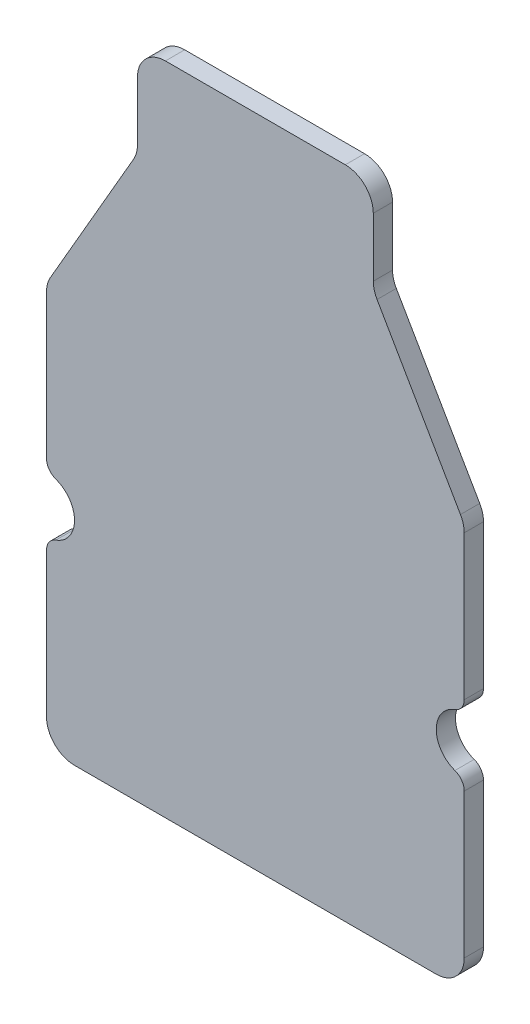
ISO-10303-21;
HEADER;
FILE_DESCRIPTION(('STEP AP214'),'2;1');
FILE_NAME('part.step','',(''),(''),'','','');
FILE_SCHEMA(('AUTOMOTIVE_DESIGN { 1 0 10303 214 1 1 1 1 }'));
ENDSEC;
DATA;
#1=APPLICATION_CONTEXT('core data for automotive mechanical design processes');
#2=APPLICATION_PROTOCOL_DEFINITION('international standard','automotive_design',2000,#1);
#3=PRODUCT_CONTEXT('',#1,'mechanical');
#4=PRODUCT('Part','Part','',(#3));
#5=PRODUCT_RELATED_PRODUCT_CATEGORY('part','',(#4));
#6=PRODUCT_DEFINITION_FORMATION('','',#4);
#7=PRODUCT_DEFINITION_CONTEXT('part definition',#1,'design');
#8=PRODUCT_DEFINITION('design','',#6,#7);
#9=PRODUCT_DEFINITION_SHAPE('','',#8);
#10=(LENGTH_UNIT() NAMED_UNIT(*) SI_UNIT(.MILLI.,.METRE.));
#11=(NAMED_UNIT(*) PLANE_ANGLE_UNIT() SI_UNIT($,.RADIAN.));
#12=(NAMED_UNIT(*) SI_UNIT($,.STERADIAN.) SOLID_ANGLE_UNIT());
#13=UNCERTAINTY_MEASURE_WITH_UNIT(LENGTH_MEASURE(1.E-05),#10,'distance_accuracy_value','');
#14=(GEOMETRIC_REPRESENTATION_CONTEXT(3) GLOBAL_UNCERTAINTY_ASSIGNED_CONTEXT((#13)) GLOBAL_UNIT_ASSIGNED_CONTEXT((#10,
#11,#12)) REPRESENTATION_CONTEXT('',''));
#15=CARTESIAN_POINT('',(0.,0.,0.));
#16=DIRECTION('',(0.,0.,1.));
#17=DIRECTION('',(1.,0.,0.));
#18=AXIS2_PLACEMENT_3D('',#15,#16,#17);
#19=CARTESIAN_POINT('',(74.65,-72.15,6.88));
#20=DIRECTION('',(-1.,0.,0.));
#21=DIRECTION('',(0.,0.,1.));
#22=AXIS2_PLACEMENT_3D('',#19,#20,#21);
#23=PLANE('',#22);
#24=DIRECTION('',(0.,1.,0.));
#25=VECTOR('',#24,1.);
#26=CARTESIAN_POINT('',(74.65,-72.15,0.));
#27=LINE('',#26,#25);
#28=CARTESIAN_POINT('',(74.65,-62.15,0.));
#29=VERTEX_POINT('',#28);
#30=CARTESIAN_POINT('',(74.65,-10.4818815858866,0.));
#31=VERTEX_POINT('',#30);
#32=EDGE_CURVE('E440',#29,#31,#27,.T.);
#33=ORIENTED_EDGE('',*,*,#32,.T.);
#34=DIRECTION('',(0.,0.,1.));
#35=VECTOR('',#34,1.);
#36=CARTESIAN_POINT('',(74.65,-10.4818815858866,6.88));
#37=LINE('',#36,#35);
#38=CARTESIAN_POINT('',(74.65,-10.4818815858866,6.88));
#39=VERTEX_POINT('',#38);
#40=EDGE_CURVE('E374',#31,#39,#37,.T.);
#41=ORIENTED_EDGE('',*,*,#40,.T.);
#42=DIRECTION('',(0.,1.,0.));
#43=VECTOR('',#42,1.);
#44=CARTESIAN_POINT('',(74.65,-72.15,6.88));
#45=LINE('',#44,#43);
#46=CARTESIAN_POINT('',(74.65,-62.15,6.88));
#47=VERTEX_POINT('',#46);
#48=EDGE_CURVE('E418',#47,#39,#45,.T.);
#49=ORIENTED_EDGE('',*,*,#48,.F.);
#50=DIRECTION('',(0.,0.,-1.));
#51=VECTOR('',#50,1.);
#52=CARTESIAN_POINT('',(74.65,-62.15,6.88));
#53=LINE('',#52,#51);
#54=EDGE_CURVE('E317',#47,#29,#53,.T.);
#55=ORIENTED_EDGE('',*,*,#54,.T.);
#56=EDGE_LOOP('',(#33,#41,#49,#55));
#57=FACE_BOUND('',#56,.T.);
#58=ADVANCED_FACE('F40',(#57),#23,.F.);
#59=CARTESIAN_POINT('',(-74.65,-72.15,6.88));
#60=DIRECTION('',(1.,0.,0.));
#61=DIRECTION('',(0.,0.,-1.));
#62=AXIS2_PLACEMENT_3D('',#59,#60,#61);
#63=PLANE('',#62);
#64=DIRECTION('',(0.,-1.,0.));
#65=VECTOR('',#64,1.);
#66=CARTESIAN_POINT('',(-74.65,-72.15,0.));
#67=LINE('',#66,#65);
#68=CARTESIAN_POINT('',(-74.65,69.4705080756887,0.));
#69=VERTEX_POINT('',#68);
#70=CARTESIAN_POINT('',(-74.65,17.8023896615754,0.));
#71=VERTEX_POINT('',#70);
#72=EDGE_CURVE('E402',#69,#71,#67,.T.);
#73=ORIENTED_EDGE('',*,*,#72,.T.);
#74=DIRECTION('',(0.,0.,1.));
#75=VECTOR('',#74,1.);
#76=CARTESIAN_POINT('',(-74.65,17.8023896615754,6.88));
#77=LINE('',#76,#75);
#78=CARTESIAN_POINT('',(-74.65,17.8023896615754,6.88));
#79=VERTEX_POINT('',#78);
#80=EDGE_CURVE('E377',#71,#79,#77,.T.);
#81=ORIENTED_EDGE('',*,*,#80,.T.);
#82=DIRECTION('',(0.,-1.,0.));
#83=VECTOR('',#82,1.);
#84=CARTESIAN_POINT('',(-74.65,-72.15,6.88));
#85=LINE('',#84,#83);
#86=CARTESIAN_POINT('',(-74.65,69.4705080756887,6.88));
#87=VERTEX_POINT('',#86);
#88=EDGE_CURVE('E400',#87,#79,#85,.T.);
#89=ORIENTED_EDGE('',*,*,#88,.F.);
#90=DIRECTION('',(0.,0.,-1.));
#91=VECTOR('',#90,1.);
#92=CARTESIAN_POINT('',(-74.65,69.4705080756887,6.88));
#93=LINE('',#92,#91);
#94=EDGE_CURVE('E326',#87,#69,#93,.T.);
#95=ORIENTED_EDGE('',*,*,#94,.T.);
#96=EDGE_LOOP('',(#73,#81,#89,#95));
#97=FACE_BOUND('',#96,.T.);
#98=ADVANCED_FACE('F399',(#97),#63,.F.);
#99=CARTESIAN_POINT('',(-74.65,-10.4818815858865,6.88));
#100=VERTEX_POINT('',#99);
#101=CARTESIAN_POINT('',(-74.65,-62.15,6.88));
#102=VERTEX_POINT('',#101);
#103=EDGE_CURVE('E266',#100,#102,#85,.T.);
#104=ORIENTED_EDGE('',*,*,#103,.F.);
#105=DIRECTION('',(0.,0.,1.));
#106=VECTOR('',#105,1.);
#107=CARTESIAN_POINT('',(-74.65,-10.4818815858865,6.88));
#108=LINE('',#107,#106);
#109=CARTESIAN_POINT('',(-74.65,-10.4818815858865,0.));
#110=VERTEX_POINT('',#109);
#111=EDGE_CURVE('E11',#100,#110,#108,.F.);
#112=ORIENTED_EDGE('',*,*,#111,.T.);
#113=CARTESIAN_POINT('',(-74.65,-62.15,0.));
#114=VERTEX_POINT('',#113);
#115=EDGE_CURVE('E436',#110,#114,#67,.T.);
#116=ORIENTED_EDGE('',*,*,#115,.T.);
#117=DIRECTION('',(0.,0.,-1.));
#118=VECTOR('',#117,1.);
#119=CARTESIAN_POINT('',(-74.65,-62.15,6.88));
#120=LINE('',#119,#118);
#121=EDGE_CURVE('E323',#114,#102,#120,.F.);
#122=ORIENTED_EDGE('',*,*,#121,.T.);
#123=EDGE_LOOP('',(#104,#112,#116,#122));
#124=FACE_BOUND('',#123,.T.);
#125=ADVANCED_FACE('F472',(#124),#63,.F.);
#126=CARTESIAN_POINT('',(74.65,-72.15,6.88));
#127=DIRECTION('',(0.,1.,0.));
#128=DIRECTION('',(-1.,0.,0.));
#129=AXIS2_PLACEMENT_3D('',#126,#127,#128);
#130=PLANE('',#129);
#131=DIRECTION('',(1.,0.,0.));
#132=VECTOR('',#131,1.);
#133=CARTESIAN_POINT('',(74.65,-72.15,0.));
#134=LINE('',#133,#132);
#135=CARTESIAN_POINT('',(-64.65,-72.15,0.));
#136=VERTEX_POINT('',#135);
#137=CARTESIAN_POINT('',(64.65,-72.15,0.));
#138=VERTEX_POINT('',#137);
#139=EDGE_CURVE('E435',#136,#138,#134,.T.);
#140=ORIENTED_EDGE('',*,*,#139,.T.);
#141=DIRECTION('',(0.,0.,-1.));
#142=VECTOR('',#141,1.);
#143=CARTESIAN_POINT('',(64.65,-72.15,6.88));
#144=LINE('',#143,#142);
#145=CARTESIAN_POINT('',(64.65,-72.15,6.88));
#146=VERTEX_POINT('',#145);
#147=EDGE_CURVE('E333',#138,#146,#144,.F.);
#148=ORIENTED_EDGE('',*,*,#147,.T.);
#149=DIRECTION('',(1.,0.,0.));
#150=VECTOR('',#149,1.);
#151=CARTESIAN_POINT('',(74.65,-72.15,6.88));
#152=LINE('',#151,#150);
#153=CARTESIAN_POINT('',(-64.65,-72.15,6.88));
#154=VERTEX_POINT('',#153);
#155=EDGE_CURVE('E408',#154,#146,#152,.T.);
#156=ORIENTED_EDGE('',*,*,#155,.F.);
#157=DIRECTION('',(0.,0.,-1.));
#158=VECTOR('',#157,1.);
#159=CARTESIAN_POINT('',(-64.65,-72.15,6.88));
#160=LINE('',#159,#158);
#161=EDGE_CURVE('E330',#154,#136,#160,.T.);
#162=ORIENTED_EDGE('',*,*,#161,.T.);
#163=EDGE_LOOP('',(#140,#148,#156,#162));
#164=FACE_BOUND('',#163,.T.);
#165=ADVANCED_FACE('F476',(#164),#130,.F.);
#166=CARTESIAN_POINT('',(74.65,17.8023896615753,6.88));
#167=VERTEX_POINT('',#166);
#168=CARTESIAN_POINT('',(74.65,69.4705080756888,6.88));
#169=VERTEX_POINT('',#168);
#170=EDGE_CURVE('E412',#167,#169,#45,.T.);
#171=ORIENTED_EDGE('',*,*,#170,.F.);
#172=DIRECTION('',(0.,0.,1.));
#173=VECTOR('',#172,1.);
#174=CARTESIAN_POINT('',(74.65,17.8023896615753,6.88));
#175=LINE('',#174,#173);
#176=CARTESIAN_POINT('',(74.65,17.8023896615753,0.));
#177=VERTEX_POINT('',#176);
#178=EDGE_CURVE('E349',#167,#177,#175,.F.);
#179=ORIENTED_EDGE('',*,*,#178,.T.);
#180=CARTESIAN_POINT('',(74.65,69.4705080756888,0.));
#181=VERTEX_POINT('',#180);
#182=EDGE_CURVE('E439',#177,#181,#27,.T.);
#183=ORIENTED_EDGE('',*,*,#182,.T.);
#184=DIRECTION('',(0.,0.,-1.));
#185=VECTOR('',#184,1.);
#186=CARTESIAN_POINT('',(74.65,69.4705080756888,6.88));
#187=LINE('',#186,#185);
#188=EDGE_CURVE('E320',#181,#169,#187,.F.);
#189=ORIENTED_EDGE('',*,*,#188,.T.);
#190=EDGE_LOOP('',(#171,#179,#183,#189));
#191=FACE_BOUND('',#190,.T.);
#192=ADVANCED_FACE('F464',(#191),#23,.F.);
#193=CARTESIAN_POINT('',(42.15,128.441651245988,6.88));
#194=DIRECTION('',(-0.866025403784438,-0.500000000000001,0.));
#195=DIRECTION('',(0.500000000000001,-0.866025403784438,0.));
#196=AXIS2_PLACEMENT_3D('',#193,#194,#195);
#197=PLANE('',#196);
#198=DIRECTION('',(-0.500000000000001,0.866025403784438,0.));
#199=VECTOR('',#198,1.);
#200=CARTESIAN_POINT('',(42.15,128.441651245988,0.));
#201=LINE('',#200,#199);
#202=CARTESIAN_POINT('',(73.3102540378444,74.4705080756888,0.));
#203=VERTEX_POINT('',#202);
#204=CARTESIAN_POINT('',(43.4897459621556,126.1211431703,0.));
#205=VERTEX_POINT('',#204);
#206=EDGE_CURVE('E259',#203,#205,#201,.T.);
#207=ORIENTED_EDGE('',*,*,#206,.T.);
#208=DIRECTION('',(0.,0.,-1.));
#209=VECTOR('',#208,1.);
#210=CARTESIAN_POINT('',(43.4897459621556,126.1211431703,6.88));
#211=LINE('',#210,#209);
#212=CARTESIAN_POINT('',(43.4897459621556,126.1211431703,6.88));
#213=VERTEX_POINT('',#212);
#214=EDGE_CURVE('E301',#205,#213,#211,.F.);
#215=ORIENTED_EDGE('',*,*,#214,.T.);
#216=DIRECTION('',(-0.500000000000001,0.866025403784438,0.));
#217=VECTOR('',#216,1.);
#218=CARTESIAN_POINT('',(42.15,128.441651245988,6.88));
#219=LINE('',#218,#217);
#220=CARTESIAN_POINT('',(73.3102540378444,74.4705080756888,6.88));
#221=VERTEX_POINT('',#220);
#222=EDGE_CURVE('E421',#221,#213,#219,.T.);
#223=ORIENTED_EDGE('',*,*,#222,.F.);
#224=DIRECTION('',(0.,0.,-1.));
#225=VECTOR('',#224,1.);
#226=CARTESIAN_POINT('',(73.3102540378444,74.4705080756888,6.88));
#227=LINE('',#226,#225);
#228=EDGE_CURVE('E298',#221,#203,#227,.T.);
#229=ORIENTED_EDGE('',*,*,#228,.T.);
#230=EDGE_LOOP('',(#207,#215,#223,#229));
#231=FACE_BOUND('',#230,.T.);
#232=ADVANCED_FACE('F446',(#231),#197,.F.);
#233=CARTESIAN_POINT('',(42.15,162.15,6.88));
#234=DIRECTION('',(-1.,0.,0.));
#235=DIRECTION('',(0.,-1.,0.));
#236=AXIS2_PLACEMENT_3D('',#233,#234,#235);
#237=PLANE('',#236);
#238=DIRECTION('',(0.,1.,0.));
#239=VECTOR('',#238,1.);
#240=CARTESIAN_POINT('',(42.15,162.15,0.));
#241=LINE('',#240,#239);
#242=CARTESIAN_POINT('',(42.15,131.1211431703,0.));
#243=VERTEX_POINT('',#242);
#244=CARTESIAN_POINT('',(42.15,152.15,0.));
#245=VERTEX_POINT('',#244);
#246=EDGE_CURVE('E251',#243,#245,#241,.T.);
#247=ORIENTED_EDGE('',*,*,#246,.T.);
#248=DIRECTION('',(0.,0.,-1.));
#249=VECTOR('',#248,1.);
#250=CARTESIAN_POINT('',(42.15,152.15,6.88));
#251=LINE('',#250,#249);
#252=CARTESIAN_POINT('',(42.15,152.15,6.88));
#253=VERTEX_POINT('',#252);
#254=EDGE_CURVE('E227',#245,#253,#251,.F.);
#255=ORIENTED_EDGE('',*,*,#254,.T.);
#256=DIRECTION('',(0.,1.,0.));
#257=VECTOR('',#256,1.);
#258=CARTESIAN_POINT('',(42.15,162.15,6.88));
#259=LINE('',#258,#257);
#260=CARTESIAN_POINT('',(42.15,131.1211431703,6.88));
#261=VERTEX_POINT('',#260);
#262=EDGE_CURVE('E424',#261,#253,#259,.T.);
#263=ORIENTED_EDGE('',*,*,#262,.F.);
#264=DIRECTION('',(0.,0.,-1.));
#265=VECTOR('',#264,1.);
#266=CARTESIAN_POINT('',(42.15,131.1211431703,0.));
#267=LINE('',#266,#265);
#268=EDGE_CURVE('E232',#261,#243,#267,.T.);
#269=ORIENTED_EDGE('',*,*,#268,.T.);
#270=EDGE_LOOP('',(#247,#255,#263,#269));
#271=FACE_BOUND('',#270,.T.);
#272=ADVANCED_FACE('F455',(#271),#237,.F.);
#273=CARTESIAN_POINT('',(-42.15,162.15,6.88));
#274=DIRECTION('',(0.,-1.,0.));
#275=DIRECTION('',(0.,0.,-1.));
#276=AXIS2_PLACEMENT_3D('',#273,#274,#275);
#277=PLANE('',#276);
#278=DIRECTION('',(-1.,0.,0.));
#279=VECTOR('',#278,1.);
#280=CARTESIAN_POINT('',(22.6884757729335,162.15,6.88));
#281=LINE('',#280,#279);
#282=CARTESIAN_POINT('',(32.15,162.15,6.88));
#283=VERTEX_POINT('',#282);
#284=CARTESIAN_POINT('',(-32.15,162.15,6.88));
#285=VERTEX_POINT('',#284);
#286=EDGE_CURVE('E242',#283,#285,#281,.T.);
#287=ORIENTED_EDGE('',*,*,#286,.F.);
#288=DIRECTION('',(0.,0.,-1.));
#289=VECTOR('',#288,1.);
#290=CARTESIAN_POINT('',(32.15,162.15,6.88));
#291=LINE('',#290,#289);
#292=CARTESIAN_POINT('',(32.15,162.15,0.));
#293=VERTEX_POINT('',#292);
#294=EDGE_CURVE('E226',#283,#293,#291,.T.);
#295=ORIENTED_EDGE('',*,*,#294,.T.);
#296=DIRECTION('',(-1.,0.,0.));
#297=VECTOR('',#296,1.);
#298=CARTESIAN_POINT('',(-42.15,162.15,0.));
#299=LINE('',#298,#297);
#300=CARTESIAN_POINT('',(-32.15,162.15,0.));
#301=VERTEX_POINT('',#300);
#302=EDGE_CURVE('E239',#293,#301,#299,.T.);
#303=ORIENTED_EDGE('',*,*,#302,.T.);
#304=DIRECTION('',(0.,0.,-1.));
#305=VECTOR('',#304,1.);
#306=CARTESIAN_POINT('',(-32.15,162.15,6.88));
#307=LINE('',#306,#305);
#308=EDGE_CURVE('E244',#301,#285,#307,.F.);
#309=ORIENTED_EDGE('',*,*,#308,.T.);
#310=EDGE_LOOP('',(#287,#295,#303,#309));
#311=FACE_BOUND('',#310,.T.);
#312=ADVANCED_FACE('F238',(#311),#277,.F.);
#313=CARTESIAN_POINT('',(-42.15,128.441651245988,6.88));
#314=DIRECTION('',(1.,0.,0.));
#315=DIRECTION('',(0.,1.,0.));
#316=AXIS2_PLACEMENT_3D('',#313,#314,#315);
#317=PLANE('',#316);
#318=DIRECTION('',(0.,-1.,0.));
#319=VECTOR('',#318,1.);
#320=CARTESIAN_POINT('',(-42.15,128.441651245988,0.));
#321=LINE('',#320,#319);
#322=CARTESIAN_POINT('',(-42.15,152.15,0.));
#323=VERTEX_POINT('',#322);
#324=CARTESIAN_POINT('',(-42.15,131.121143170299,0.));
#325=VERTEX_POINT('',#324);
#326=EDGE_CURVE('E250',#323,#325,#321,.T.);
#327=ORIENTED_EDGE('',*,*,#326,.T.);
#328=DIRECTION('',(0.,0.,-1.));
#329=VECTOR('',#328,1.);
#330=CARTESIAN_POINT('',(-42.15,131.121143170299,6.88));
#331=LINE('',#330,#329);
#332=CARTESIAN_POINT('',(-42.15,131.121143170299,6.88));
#333=VERTEX_POINT('',#332);
#334=EDGE_CURVE('E314',#325,#333,#331,.F.);
#335=ORIENTED_EDGE('',*,*,#334,.T.);
#336=DIRECTION('',(0.,-1.,0.));
#337=VECTOR('',#336,1.);
#338=CARTESIAN_POINT('',(-42.15,128.441651245988,6.88));
#339=LINE('',#338,#337);
#340=CARTESIAN_POINT('',(-42.15,152.15,6.88));
#341=VERTEX_POINT('',#340);
#342=EDGE_CURVE('E428',#341,#333,#339,.T.);
#343=ORIENTED_EDGE('',*,*,#342,.F.);
#344=DIRECTION('',(0.,0.,-1.));
#345=VECTOR('',#344,1.);
#346=CARTESIAN_POINT('',(-42.15,152.15,6.88));
#347=LINE('',#346,#345);
#348=EDGE_CURVE('E310',#341,#323,#347,.T.);
#349=ORIENTED_EDGE('',*,*,#348,.T.);
#350=EDGE_LOOP('',(#327,#335,#343,#349));
#351=FACE_BOUND('',#350,.T.);
#352=ADVANCED_FACE('F462',(#351),#317,.F.);
#353=CARTESIAN_POINT('',(-74.65,72.15,6.88));
#354=DIRECTION('',(0.866025403784438,-0.500000000000001,0.));
#355=DIRECTION('',(0.500000000000001,0.866025403784438,0.));
#356=AXIS2_PLACEMENT_3D('',#353,#354,#355);
#357=PLANE('',#356);
#358=DIRECTION('',(-0.500000000000001,-0.866025403784438,0.));
#359=VECTOR('',#358,1.);
#360=CARTESIAN_POINT('',(-74.65,72.15,6.88));
#361=LINE('',#360,#359);
#362=CARTESIAN_POINT('',(-43.4897459621556,126.1211431703,6.88));
#363=VERTEX_POINT('',#362);
#364=CARTESIAN_POINT('',(-73.3102540378444,74.4705080756888,6.88));
#365=VERTEX_POINT('',#364);
#366=EDGE_CURVE('E268',#363,#365,#361,.T.);
#367=ORIENTED_EDGE('',*,*,#366,.F.);
#368=DIRECTION('',(0.,0.,-1.));
#369=VECTOR('',#368,1.);
#370=CARTESIAN_POINT('',(-43.4897459621556,126.121143170299,0.));
#371=LINE('',#370,#369);
#372=CARTESIAN_POINT('',(-43.4897459621556,126.1211431703,0.));
#373=VERTEX_POINT('',#372);
#374=EDGE_CURVE('E306',#363,#373,#371,.T.);
#375=ORIENTED_EDGE('',*,*,#374,.T.);
#376=DIRECTION('',(-0.500000000000001,-0.866025403784438,0.));
#377=VECTOR('',#376,1.);
#378=CARTESIAN_POINT('',(-74.65,72.15,0.));
#379=LINE('',#378,#377);
#380=CARTESIAN_POINT('',(-73.3102540378444,74.4705080756888,0.));
#381=VERTEX_POINT('',#380);
#382=EDGE_CURVE('E257',#373,#381,#379,.T.);
#383=ORIENTED_EDGE('',*,*,#382,.T.);
#384=DIRECTION('',(0.,0.,-1.));
#385=VECTOR('',#384,1.);
#386=CARTESIAN_POINT('',(-73.3102540378444,74.4705080756888,6.88));
#387=LINE('',#386,#385);
#388=EDGE_CURVE('E303',#381,#365,#387,.F.);
#389=ORIENTED_EDGE('',*,*,#388,.T.);
#390=EDGE_LOOP('',(#367,#375,#383,#389));
#391=FACE_BOUND('',#390,.T.);
#392=ADVANCED_FACE('F593',(#391),#357,.F.);
#393=CARTESIAN_POINT('',(0.,0.,6.88));
#394=DIRECTION('',(0.,0.,-1.));
#395=DIRECTION('',(-1.,0.,0.));
#396=AXIS2_PLACEMENT_3D('',#393,#394,#395);
#397=PLANE('',#396);
#398=CARTESIAN_POINT('',(74.65,3.66025403784438,6.88));
#399=DIRECTION('',(0.,0.,1.));
#400=DIRECTION('',(1.,0.,0.));
#401=AXIS2_PLACEMENT_3D('',#398,#399,#400);
#402=CIRCLE('',#401,9.99999999999999);
#403=CARTESIAN_POINT('',(71.3166666666667,13.088344453665,6.88));
#404=VERTEX_POINT('',#403);
#405=CARTESIAN_POINT('',(71.3166666666667,-5.76783637797625,6.88));
#406=VERTEX_POINT('',#405);
#407=EDGE_CURVE('E498',#404,#406,#402,.T.);
#408=ORIENTED_EDGE('',*,*,#407,.F.);
#409=CARTESIAN_POINT('',(69.65,17.8023896615753,6.88));
#410=DIRECTION('',(0.,0.,-1.));
#411=DIRECTION('',(-1.,0.,0.));
#412=AXIS2_PLACEMENT_3D('',#409,#410,#411);
#413=CIRCLE('',#412,5.);
#414=EDGE_CURVE('E372',#404,#167,#413,.F.);
#415=ORIENTED_EDGE('',*,*,#414,.T.);
#416=ORIENTED_EDGE('',*,*,#170,.T.);
#417=CARTESIAN_POINT('',(64.65,69.4705080756887,6.88));
#418=DIRECTION('',(0.,0.,-1.));
#419=DIRECTION('',(-1.,0.,0.));
#420=AXIS2_PLACEMENT_3D('',#417,#418,#419);
#421=CIRCLE('',#420,10.);
#422=EDGE_CURVE('E292',#169,#221,#421,.F.);
#423=ORIENTED_EDGE('',*,*,#422,.T.);
#424=ORIENTED_EDGE('',*,*,#222,.T.);
#425=CARTESIAN_POINT('',(52.15,131.1211431703,6.88));
#426=DIRECTION('',(0.,0.,-1.));
#427=DIRECTION('',(-1.,0.,0.));
#428=AXIS2_PLACEMENT_3D('',#425,#426,#427);
#429=CIRCLE('',#428,10.);
#430=EDGE_CURVE('E337',#213,#261,#429,.T.);
#431=ORIENTED_EDGE('',*,*,#430,.T.);
#432=ORIENTED_EDGE('',*,*,#262,.T.);
#433=CARTESIAN_POINT('',(32.15,152.15,6.88));
#434=DIRECTION('',(0.,0.,-1.));
#435=DIRECTION('',(-1.,0.,0.));
#436=AXIS2_PLACEMENT_3D('',#433,#434,#435);
#437=CIRCLE('',#436,10.);
#438=EDGE_CURVE('E296',#253,#283,#437,.F.);
#439=ORIENTED_EDGE('',*,*,#438,.T.);
#440=ORIENTED_EDGE('',*,*,#286,.T.);
#441=CARTESIAN_POINT('',(-32.15,152.15,6.88));
#442=DIRECTION('',(0.,0.,-1.));
#443=DIRECTION('',(-1.,0.,0.));
#444=AXIS2_PLACEMENT_3D('',#441,#442,#443);
#445=CIRCLE('',#444,10.);
#446=EDGE_CURVE('E294',#285,#341,#445,.F.);
#447=ORIENTED_EDGE('',*,*,#446,.T.);
#448=ORIENTED_EDGE('',*,*,#342,.T.);
#449=CARTESIAN_POINT('',(-52.15,131.121143170299,6.88));
#450=DIRECTION('',(0.,0.,-1.));
#451=DIRECTION('',(-1.,0.,0.));
#452=AXIS2_PLACEMENT_3D('',#449,#450,#451);
#453=CIRCLE('',#452,10.);
#454=EDGE_CURVE('E342',#333,#363,#453,.T.);
#455=ORIENTED_EDGE('',*,*,#454,.T.);
#456=ORIENTED_EDGE('',*,*,#366,.T.);
#457=CARTESIAN_POINT('',(-64.65,69.4705080756887,6.88));
#458=DIRECTION('',(0.,0.,-1.));
#459=DIRECTION('',(-1.,0.,0.));
#460=AXIS2_PLACEMENT_3D('',#457,#458,#459);
#461=CIRCLE('',#460,10.);
#462=EDGE_CURVE('E289',#365,#87,#461,.F.);
#463=ORIENTED_EDGE('',*,*,#462,.T.);
#464=ORIENTED_EDGE('',*,*,#88,.T.);
#465=CARTESIAN_POINT('',(-69.65,17.8023896615754,6.88));
#466=DIRECTION('',(0.,0.,-1.));
#467=DIRECTION('',(-1.,0.,0.));
#468=AXIS2_PLACEMENT_3D('',#465,#466,#467);
#469=CIRCLE('',#468,5.);
#470=CARTESIAN_POINT('',(-71.3166666666666,13.088344453665,6.88));
#471=VERTEX_POINT('',#470);
#472=EDGE_CURVE('E68',#79,#471,#469,.F.);
#473=ORIENTED_EDGE('',*,*,#472,.T.);
#474=CARTESIAN_POINT('',(-74.65,3.66025403784441,6.88));
#475=DIRECTION('',(0.,0.,1.));
#476=DIRECTION('',(1.,0.,0.));
#477=AXIS2_PLACEMENT_3D('',#474,#475,#476);
#478=CIRCLE('',#477,10.);
#479=CARTESIAN_POINT('',(-71.3166666666666,-5.76783637797623,6.88));
#480=VERTEX_POINT('',#479);
#481=EDGE_CURVE('E389',#480,#471,#478,.T.);
#482=ORIENTED_EDGE('',*,*,#481,.F.);
#483=CARTESIAN_POINT('',(-69.65,-10.4818815858865,6.88));
#484=DIRECTION('',(0.,0.,-1.));
#485=DIRECTION('',(-1.,0.,0.));
#486=AXIS2_PLACEMENT_3D('',#483,#484,#485);
#487=CIRCLE('',#486,5.);
#488=EDGE_CURVE('E59',#480,#100,#487,.F.);
#489=ORIENTED_EDGE('',*,*,#488,.T.);
#490=ORIENTED_EDGE('',*,*,#103,.T.);
#491=CARTESIAN_POINT('',(-64.65,-62.15,6.88));
#492=DIRECTION('',(0.,0.,-1.));
#493=DIRECTION('',(-1.,0.,0.));
#494=AXIS2_PLACEMENT_3D('',#491,#492,#493);
#495=CIRCLE('',#494,10.);
#496=EDGE_CURVE('E285',#102,#154,#495,.F.);
#497=ORIENTED_EDGE('',*,*,#496,.T.);
#498=ORIENTED_EDGE('',*,*,#155,.T.);
#499=CARTESIAN_POINT('',(64.65,-62.15,6.88));
#500=DIRECTION('',(0.,0.,-1.));
#501=DIRECTION('',(-1.,0.,0.));
#502=AXIS2_PLACEMENT_3D('',#499,#500,#501);
#503=CIRCLE('',#502,10.);
#504=EDGE_CURVE('E287',#146,#47,#503,.F.);
#505=ORIENTED_EDGE('',*,*,#504,.T.);
#506=ORIENTED_EDGE('',*,*,#48,.T.);
#507=CARTESIAN_POINT('',(69.65,-10.4818815858866,6.88));
#508=DIRECTION('',(0.,0.,-1.));
#509=DIRECTION('',(-1.,0.,0.));
#510=AXIS2_PLACEMENT_3D('',#507,#508,#509);
#511=CIRCLE('',#510,5.);
#512=EDGE_CURVE('E370',#39,#406,#511,.F.);
#513=ORIENTED_EDGE('',*,*,#512,.T.);
#514=EDGE_LOOP('',(#408,#415,#416,#423,#424,#431,#432,#439,#440,#447,#448,#455,#456,#463,#464,
#473,#482,#489,#490,#497,#498,#505,#506,#513));
#515=FACE_BOUND('',#514,.T.);
#516=ADVANCED_FACE('F404',(#515),#397,.F.);
#517=CARTESIAN_POINT('',(0.,0.,0.));
#518=DIRECTION('',(0.,0.,-1.));
#519=DIRECTION('',(-1.,0.,0.));
#520=AXIS2_PLACEMENT_3D('',#517,#518,#519);
#521=PLANE('',#520);
#522=ORIENTED_EDGE('',*,*,#182,.F.);
#523=CARTESIAN_POINT('',(69.65,17.8023896615753,0.));
#524=DIRECTION('',(0.,0.,-1.));
#525=DIRECTION('',(-1.,0.,0.));
#526=AXIS2_PLACEMENT_3D('',#523,#524,#525);
#527=CIRCLE('',#526,5.);
#528=CARTESIAN_POINT('',(71.3166666666667,13.088344453665,0.));
#529=VERTEX_POINT('',#528);
#530=EDGE_CURVE('E360',#177,#529,#527,.T.);
#531=ORIENTED_EDGE('',*,*,#530,.T.);
#532=CARTESIAN_POINT('',(74.65,3.66025403784438,0.));
#533=DIRECTION('',(0.,0.,1.));
#534=DIRECTION('',(1.,0.,0.));
#535=AXIS2_PLACEMENT_3D('',#532,#533,#534);
#536=CIRCLE('',#535,9.99999999999999);
#537=CARTESIAN_POINT('',(71.3166666666667,-5.76783637797625,0.));
#538=VERTEX_POINT('',#537);
#539=EDGE_CURVE('E492',#529,#538,#536,.T.);
#540=ORIENTED_EDGE('',*,*,#539,.T.);
#541=CARTESIAN_POINT('',(69.65,-10.4818815858866,0.));
#542=DIRECTION('',(0.,0.,-1.));
#543=DIRECTION('',(-1.,0.,0.));
#544=AXIS2_PLACEMENT_3D('',#541,#542,#543);
#545=CIRCLE('',#544,5.);
#546=EDGE_CURVE('E358',#538,#31,#545,.T.);
#547=ORIENTED_EDGE('',*,*,#546,.T.);
#548=ORIENTED_EDGE('',*,*,#32,.F.);
#549=CARTESIAN_POINT('',(64.65,-62.15,0.));
#550=DIRECTION('',(0.,0.,-1.));
#551=DIRECTION('',(-1.,0.,0.));
#552=AXIS2_PLACEMENT_3D('',#549,#550,#551);
#553=CIRCLE('',#552,10.);
#554=EDGE_CURVE('E272',#29,#138,#553,.T.);
#555=ORIENTED_EDGE('',*,*,#554,.T.);
#556=ORIENTED_EDGE('',*,*,#139,.F.);
#557=CARTESIAN_POINT('',(-64.65,-62.15,0.));
#558=DIRECTION('',(0.,0.,-1.));
#559=DIRECTION('',(-1.,0.,0.));
#560=AXIS2_PLACEMENT_3D('',#557,#558,#559);
#561=CIRCLE('',#560,10.);
#562=EDGE_CURVE('E243',#136,#114,#561,.T.);
#563=ORIENTED_EDGE('',*,*,#562,.T.);
#564=ORIENTED_EDGE('',*,*,#115,.F.);
#565=CARTESIAN_POINT('',(-69.65,-10.4818815858865,0.));
#566=DIRECTION('',(0.,0.,-1.));
#567=DIRECTION('',(-1.,0.,0.));
#568=AXIS2_PLACEMENT_3D('',#565,#566,#567);
#569=CIRCLE('',#568,5.);
#570=CARTESIAN_POINT('',(-71.3166666666666,-5.76783637797623,0.));
#571=VERTEX_POINT('',#570);
#572=EDGE_CURVE('E352',#110,#571,#569,.T.);
#573=ORIENTED_EDGE('',*,*,#572,.T.);
#574=CARTESIAN_POINT('',(-74.65,3.66025403784441,0.));
#575=DIRECTION('',(0.,0.,-1.));
#576=DIRECTION('',(-1.,0.,0.));
#577=AXIS2_PLACEMENT_3D('',#574,#575,#576);
#578=CIRCLE('',#577,10.);
#579=CARTESIAN_POINT('',(-71.3166666666666,13.088344453665,0.));
#580=VERTEX_POINT('',#579);
#581=EDGE_CURVE('E345',#580,#571,#578,.T.);
#582=ORIENTED_EDGE('',*,*,#581,.F.);
#583=CARTESIAN_POINT('',(-69.65,17.8023896615754,0.));
#584=DIRECTION('',(0.,0.,-1.));
#585=DIRECTION('',(-1.,0.,0.));
#586=AXIS2_PLACEMENT_3D('',#583,#584,#585);
#587=CIRCLE('',#586,5.);
#588=EDGE_CURVE('E355',#580,#71,#587,.T.);
#589=ORIENTED_EDGE('',*,*,#588,.T.);
#590=ORIENTED_EDGE('',*,*,#72,.F.);
#591=CARTESIAN_POINT('',(-64.65,69.4705080756887,0.));
#592=DIRECTION('',(0.,0.,-1.));
#593=DIRECTION('',(-1.,0.,0.));
#594=AXIS2_PLACEMENT_3D('',#591,#592,#593);
#595=CIRCLE('',#594,10.);
#596=EDGE_CURVE('E274',#69,#381,#595,.T.);
#597=ORIENTED_EDGE('',*,*,#596,.T.);
#598=ORIENTED_EDGE('',*,*,#382,.F.);
#599=CARTESIAN_POINT('',(-52.15,131.121143170299,0.));
#600=DIRECTION('',(0.,0.,-1.));
#601=DIRECTION('',(-1.,0.,0.));
#602=AXIS2_PLACEMENT_3D('',#599,#600,#601);
#603=CIRCLE('',#602,10.);
#604=EDGE_CURVE('E339',#373,#325,#603,.F.);
#605=ORIENTED_EDGE('',*,*,#604,.T.);
#606=ORIENTED_EDGE('',*,*,#326,.F.);
#607=CARTESIAN_POINT('',(-32.15,152.15,0.));
#608=DIRECTION('',(0.,0.,-1.));
#609=DIRECTION('',(-1.,0.,0.));
#610=AXIS2_PLACEMENT_3D('',#607,#608,#609);
#611=CIRCLE('',#610,10.);
#612=EDGE_CURVE('E233',#323,#301,#611,.T.);
#613=ORIENTED_EDGE('',*,*,#612,.T.);
#614=ORIENTED_EDGE('',*,*,#302,.F.);
#615=CARTESIAN_POINT('',(32.15,152.15,0.));
#616=DIRECTION('',(0.,0.,-1.));
#617=DIRECTION('',(-1.,0.,0.));
#618=AXIS2_PLACEMENT_3D('',#615,#616,#617);
#619=CIRCLE('',#618,10.);
#620=EDGE_CURVE('E222',#293,#245,#619,.T.);
#621=ORIENTED_EDGE('',*,*,#620,.T.);
#622=ORIENTED_EDGE('',*,*,#246,.F.);
#623=CARTESIAN_POINT('',(52.15,131.1211431703,0.));
#624=DIRECTION('',(0.,0.,-1.));
#625=DIRECTION('',(-1.,0.,0.));
#626=AXIS2_PLACEMENT_3D('',#623,#624,#625);
#627=CIRCLE('',#626,10.);
#628=EDGE_CURVE('E335',#243,#205,#627,.F.);
#629=ORIENTED_EDGE('',*,*,#628,.T.);
#630=ORIENTED_EDGE('',*,*,#206,.F.);
#631=CARTESIAN_POINT('',(64.65,69.4705080756887,0.));
#632=DIRECTION('',(0.,0.,-1.));
#633=DIRECTION('',(-1.,0.,0.));
#634=AXIS2_PLACEMENT_3D('',#631,#632,#633);
#635=CIRCLE('',#634,10.);
#636=EDGE_CURVE('E277',#203,#181,#635,.T.);
#637=ORIENTED_EDGE('',*,*,#636,.T.);
#638=EDGE_LOOP('',(#522,#531,#540,#547,#548,#555,#556,#563,#564,#573,#582,#589,#590,#597,#598,
#605,#606,#613,#614,#621,#622,#629,#630,#637));
#639=FACE_BOUND('',#638,.T.);
#640=ADVANCED_FACE('F247',(#639),#521,.T.);
#641=CARTESIAN_POINT('',(32.15,152.15,6.88));
#642=DIRECTION('',(0.,0.,-1.));
#643=DIRECTION('',(-1.,0.,0.));
#644=AXIS2_PLACEMENT_3D('',#641,#642,#643);
#645=CYLINDRICAL_SURFACE('',#644,10.);
#646=ORIENTED_EDGE('',*,*,#438,.F.);
#647=ORIENTED_EDGE('',*,*,#254,.F.);
#648=ORIENTED_EDGE('',*,*,#620,.F.);
#649=ORIENTED_EDGE('',*,*,#294,.F.);
#650=EDGE_LOOP('',(#646,#647,#648,#649));
#651=FACE_BOUND('',#650,.T.);
#652=ADVANCED_FACE('F225',(#651),#645,.T.);
#653=CARTESIAN_POINT('',(52.15,131.1211431703,6.88));
#654=DIRECTION('',(0.,0.,1.));
#655=DIRECTION('',(1.,0.,0.));
#656=AXIS2_PLACEMENT_3D('',#653,#654,#655);
#657=CYLINDRICAL_SURFACE('',#656,10.);
#658=ORIENTED_EDGE('',*,*,#430,.F.);
#659=ORIENTED_EDGE('',*,*,#214,.F.);
#660=ORIENTED_EDGE('',*,*,#628,.F.);
#661=ORIENTED_EDGE('',*,*,#268,.F.);
#662=EDGE_LOOP('',(#658,#659,#660,#661));
#663=FACE_BOUND('',#662,.T.);
#664=ADVANCED_FACE('F451',(#663),#657,.F.);
#665=CARTESIAN_POINT('',(-52.15,131.121143170299,6.88));
#666=DIRECTION('',(0.,0.,1.));
#667=DIRECTION('',(1.,0.,0.));
#668=AXIS2_PLACEMENT_3D('',#665,#666,#667);
#669=CYLINDRICAL_SURFACE('',#668,10.);
#670=ORIENTED_EDGE('',*,*,#454,.F.);
#671=ORIENTED_EDGE('',*,*,#334,.F.);
#672=ORIENTED_EDGE('',*,*,#604,.F.);
#673=ORIENTED_EDGE('',*,*,#374,.F.);
#674=EDGE_LOOP('',(#670,#671,#672,#673));
#675=FACE_BOUND('',#674,.T.);
#676=ADVANCED_FACE('F548',(#675),#669,.F.);
#677=CARTESIAN_POINT('',(-32.15,152.15,6.88));
#678=DIRECTION('',(0.,0.,-1.));
#679=DIRECTION('',(-1.,0.,0.));
#680=AXIS2_PLACEMENT_3D('',#677,#678,#679);
#681=CYLINDRICAL_SURFACE('',#680,10.);
#682=ORIENTED_EDGE('',*,*,#446,.F.);
#683=ORIENTED_EDGE('',*,*,#308,.F.);
#684=ORIENTED_EDGE('',*,*,#612,.F.);
#685=ORIENTED_EDGE('',*,*,#348,.F.);
#686=EDGE_LOOP('',(#682,#683,#684,#685));
#687=FACE_BOUND('',#686,.T.);
#688=ADVANCED_FACE('F544',(#687),#681,.T.);
#689=CARTESIAN_POINT('',(64.65,69.4705080756887,6.88));
#690=DIRECTION('',(0.,0.,-1.));
#691=DIRECTION('',(-1.,0.,0.));
#692=AXIS2_PLACEMENT_3D('',#689,#690,#691);
#693=CYLINDRICAL_SURFACE('',#692,10.);
#694=ORIENTED_EDGE('',*,*,#422,.F.);
#695=ORIENTED_EDGE('',*,*,#188,.F.);
#696=ORIENTED_EDGE('',*,*,#636,.F.);
#697=ORIENTED_EDGE('',*,*,#228,.F.);
#698=EDGE_LOOP('',(#694,#695,#696,#697));
#699=FACE_BOUND('',#698,.T.);
#700=ADVANCED_FACE('F540',(#699),#693,.T.);
#701=CARTESIAN_POINT('',(-64.65,69.4705080756887,6.88));
#702=DIRECTION('',(0.,0.,-1.));
#703=DIRECTION('',(-1.,0.,0.));
#704=AXIS2_PLACEMENT_3D('',#701,#702,#703);
#705=CYLINDRICAL_SURFACE('',#704,10.);
#706=ORIENTED_EDGE('',*,*,#462,.F.);
#707=ORIENTED_EDGE('',*,*,#388,.F.);
#708=ORIENTED_EDGE('',*,*,#596,.F.);
#709=ORIENTED_EDGE('',*,*,#94,.F.);
#710=EDGE_LOOP('',(#706,#707,#708,#709));
#711=FACE_BOUND('',#710,.T.);
#712=ADVANCED_FACE('F537',(#711),#705,.T.);
#713=CARTESIAN_POINT('',(64.65,-62.15,6.88));
#714=DIRECTION('',(0.,0.,-1.));
#715=DIRECTION('',(-1.,0.,0.));
#716=AXIS2_PLACEMENT_3D('',#713,#714,#715);
#717=CYLINDRICAL_SURFACE('',#716,10.);
#718=ORIENTED_EDGE('',*,*,#504,.F.);
#719=ORIENTED_EDGE('',*,*,#147,.F.);
#720=ORIENTED_EDGE('',*,*,#554,.F.);
#721=ORIENTED_EDGE('',*,*,#54,.F.);
#722=EDGE_LOOP('',(#718,#719,#720,#721));
#723=FACE_BOUND('',#722,.T.);
#724=ADVANCED_FACE('F509',(#723),#717,.T.);
#725=CARTESIAN_POINT('',(-64.65,-62.15,6.88));
#726=DIRECTION('',(0.,0.,-1.));
#727=DIRECTION('',(-1.,0.,0.));
#728=AXIS2_PLACEMENT_3D('',#725,#726,#727);
#729=CYLINDRICAL_SURFACE('',#728,10.);
#730=ORIENTED_EDGE('',*,*,#496,.F.);
#731=ORIENTED_EDGE('',*,*,#121,.F.);
#732=ORIENTED_EDGE('',*,*,#562,.F.);
#733=ORIENTED_EDGE('',*,*,#161,.F.);
#734=EDGE_LOOP('',(#730,#731,#732,#733));
#735=FACE_BOUND('',#734,.T.);
#736=ADVANCED_FACE('F516',(#735),#729,.T.);
#737=CARTESIAN_POINT('',(-74.65,3.66025403784441,0.));
#738=DIRECTION('',(0.,0.,1.));
#739=DIRECTION('',(1.,0.,0.));
#740=AXIS2_PLACEMENT_3D('',#737,#738,#739);
#741=CYLINDRICAL_SURFACE('',#740,10.);
#742=ORIENTED_EDGE('',*,*,#481,.T.);
#743=DIRECTION('',(0.,0.,1.));
#744=VECTOR('',#743,1.);
#745=CARTESIAN_POINT('',(-71.3166666666666,13.088344453665,0.));
#746=LINE('',#745,#744);
#747=EDGE_CURVE('E49',#471,#580,#746,.F.);
#748=ORIENTED_EDGE('',*,*,#747,.T.);
#749=ORIENTED_EDGE('',*,*,#581,.T.);
#750=DIRECTION('',(0.,0.,1.));
#751=VECTOR('',#750,1.);
#752=CARTESIAN_POINT('',(-71.3166666666666,-5.76783637797623,0.));
#753=LINE('',#752,#751);
#754=EDGE_CURVE('E381',#571,#480,#753,.T.);
#755=ORIENTED_EDGE('',*,*,#754,.T.);
#756=EDGE_LOOP('',(#742,#748,#749,#755));
#757=FACE_BOUND('',#756,.T.);
#758=ADVANCED_FACE('F387',(#757),#741,.F.);
#759=CARTESIAN_POINT('',(74.65,3.66025403784438,0.));
#760=DIRECTION('',(0.,0.,1.));
#761=DIRECTION('',(1.,0.,0.));
#762=AXIS2_PLACEMENT_3D('',#759,#760,#761);
#763=CYLINDRICAL_SURFACE('',#762,9.99999999999999);
#764=ORIENTED_EDGE('',*,*,#539,.F.);
#765=DIRECTION('',(0.,0.,1.));
#766=VECTOR('',#765,1.);
#767=CARTESIAN_POINT('',(71.3166666666667,13.088344453665,0.));
#768=LINE('',#767,#766);
#769=EDGE_CURVE('E364',#529,#404,#768,.T.);
#770=ORIENTED_EDGE('',*,*,#769,.T.);
#771=ORIENTED_EDGE('',*,*,#407,.T.);
#772=DIRECTION('',(0.,0.,1.));
#773=VECTOR('',#772,1.);
#774=CARTESIAN_POINT('',(71.3166666666667,-5.76783637797625,0.));
#775=LINE('',#774,#773);
#776=EDGE_CURVE('E362',#406,#538,#775,.F.);
#777=ORIENTED_EDGE('',*,*,#776,.T.);
#778=EDGE_LOOP('',(#764,#770,#771,#777));
#779=FACE_BOUND('',#778,.T.);
#780=ADVANCED_FACE('F495',(#779),#763,.F.);
#781=CARTESIAN_POINT('',(69.65,17.8023896615753,0.));
#782=DIRECTION('',(0.,0.,1.));
#783=DIRECTION('',(1.,0.,0.));
#784=AXIS2_PLACEMENT_3D('',#781,#782,#783);
#785=CYLINDRICAL_SURFACE('',#784,5.);
#786=ORIENTED_EDGE('',*,*,#414,.F.);
#787=ORIENTED_EDGE('',*,*,#769,.F.);
#788=ORIENTED_EDGE('',*,*,#530,.F.);
#789=ORIENTED_EDGE('',*,*,#178,.F.);
#790=EDGE_LOOP('',(#786,#787,#788,#789));
#791=FACE_BOUND('',#790,.T.);
#792=ADVANCED_FACE('F488',(#791),#785,.T.);
#793=CARTESIAN_POINT('',(69.65,-10.4818815858866,0.));
#794=DIRECTION('',(0.,0.,1.));
#795=DIRECTION('',(1.,0.,0.));
#796=AXIS2_PLACEMENT_3D('',#793,#794,#795);
#797=CYLINDRICAL_SURFACE('',#796,5.);
#798=ORIENTED_EDGE('',*,*,#546,.F.);
#799=ORIENTED_EDGE('',*,*,#776,.F.);
#800=ORIENTED_EDGE('',*,*,#512,.F.);
#801=ORIENTED_EDGE('',*,*,#40,.F.);
#802=EDGE_LOOP('',(#798,#799,#800,#801));
#803=FACE_BOUND('',#802,.T.);
#804=ADVANCED_FACE('F502',(#803),#797,.T.);
#805=CARTESIAN_POINT('',(-69.65,17.8023896615754,0.));
#806=DIRECTION('',(0.,0.,1.));
#807=DIRECTION('',(1.,0.,0.));
#808=AXIS2_PLACEMENT_3D('',#805,#806,#807);
#809=CYLINDRICAL_SURFACE('',#808,5.);
#810=ORIENTED_EDGE('',*,*,#588,.F.);
#811=ORIENTED_EDGE('',*,*,#747,.F.);
#812=ORIENTED_EDGE('',*,*,#472,.F.);
#813=ORIENTED_EDGE('',*,*,#80,.F.);
#814=EDGE_LOOP('',(#810,#811,#812,#813));
#815=FACE_BOUND('',#814,.T.);
#816=ADVANCED_FACE('F396',(#815),#809,.T.);
#817=CARTESIAN_POINT('',(-69.65,-10.4818815858865,0.));
#818=DIRECTION('',(0.,0.,1.));
#819=DIRECTION('',(1.,0.,0.));
#820=AXIS2_PLACEMENT_3D('',#817,#818,#819);
#821=CYLINDRICAL_SURFACE('',#820,5.);
#822=ORIENTED_EDGE('',*,*,#488,.F.);
#823=ORIENTED_EDGE('',*,*,#754,.F.);
#824=ORIENTED_EDGE('',*,*,#572,.F.);
#825=ORIENTED_EDGE('',*,*,#111,.F.);
#826=EDGE_LOOP('',(#822,#823,#824,#825));
#827=FACE_BOUND('',#826,.T.);
#828=ADVANCED_FACE('F42',(#827),#821,.T.);
#829=CLOSED_SHELL('',(#58,#98,#125,#165,#192,#232,#272,#312,#352,#392,#516,#640,#652,#664,#676,
#688,#700,#712,#724,#736,#758,#780,#792,#804,#816,#828));
#830=MANIFOLD_SOLID_BREP('B2',#829);
#831=ADVANCED_BREP_SHAPE_REPRESENTATION('',(#18,#830),#14);
#832=SHAPE_DEFINITION_REPRESENTATION(#9,#831);
ENDSEC;
END-ISO-10303-21;
